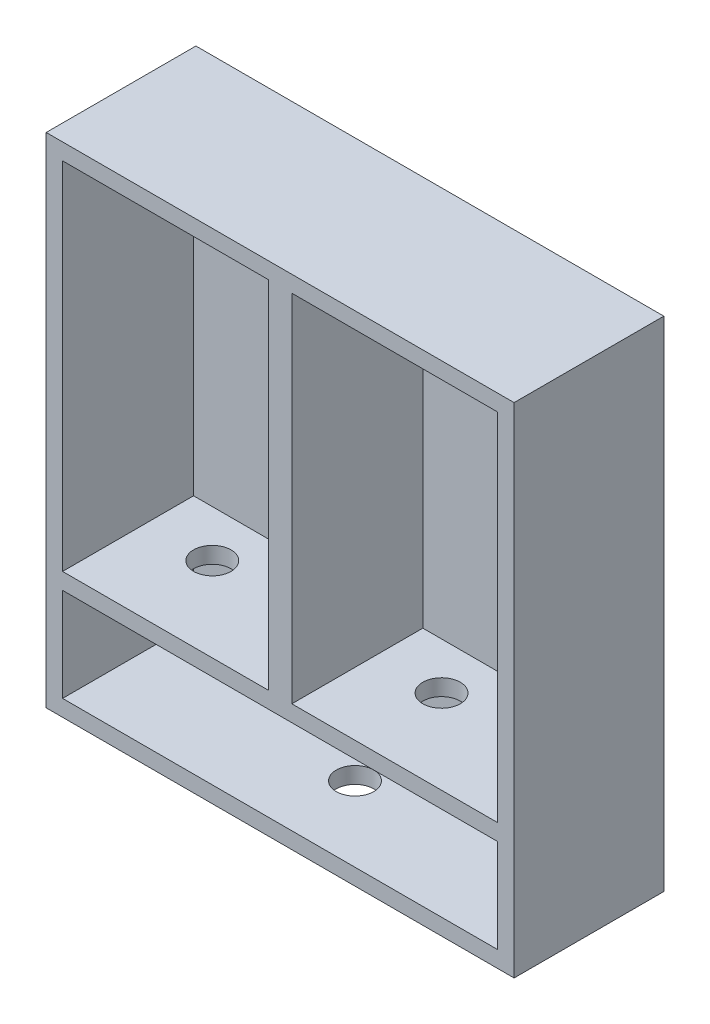
ISO-10303-21;
HEADER;
FILE_DESCRIPTION(('STEP AP214'),'2;1');
FILE_NAME('part.step','',(''),(''),'','','');
FILE_SCHEMA(('AUTOMOTIVE_DESIGN { 1 0 10303 214 1 1 1 1 }'));
ENDSEC;
DATA;
#1=APPLICATION_CONTEXT('core data for automotive mechanical design processes');
#2=APPLICATION_PROTOCOL_DEFINITION('international standard','automotive_design',2000,#1);
#3=PRODUCT_CONTEXT('',#1,'mechanical');
#4=PRODUCT('Part','Part','',(#3));
#5=PRODUCT_RELATED_PRODUCT_CATEGORY('part','',(#4));
#6=PRODUCT_DEFINITION_FORMATION('','',#4);
#7=PRODUCT_DEFINITION_CONTEXT('part definition',#1,'design');
#8=PRODUCT_DEFINITION('design','',#6,#7);
#9=PRODUCT_DEFINITION_SHAPE('','',#8);
#10=(LENGTH_UNIT() NAMED_UNIT(*) SI_UNIT(.MILLI.,.METRE.));
#11=(NAMED_UNIT(*) PLANE_ANGLE_UNIT() SI_UNIT($,.RADIAN.));
#12=(NAMED_UNIT(*) SI_UNIT($,.STERADIAN.) SOLID_ANGLE_UNIT());
#13=UNCERTAINTY_MEASURE_WITH_UNIT(LENGTH_MEASURE(1.E-05),#10,'distance_accuracy_value','');
#14=(GEOMETRIC_REPRESENTATION_CONTEXT(3) GLOBAL_UNCERTAINTY_ASSIGNED_CONTEXT((#13)) GLOBAL_UNIT_ASSIGNED_CONTEXT((#10,
#11,#12)) REPRESENTATION_CONTEXT('',''));
#15=CARTESIAN_POINT('',(0.,0.,0.));
#16=DIRECTION('',(0.,0.,1.));
#17=DIRECTION('',(1.,0.,0.));
#18=AXIS2_PLACEMENT_3D('',#15,#16,#17);
#19=CARTESIAN_POINT('',(0.,0.,20.32));
#20=DIRECTION('',(0.,0.,-1.));
#21=DIRECTION('',(-1.,0.,0.));
#22=AXIS2_PLACEMENT_3D('',#19,#20,#21);
#23=PLANE('',#22);
#24=DIRECTION('',(1.,0.,0.));
#25=VECTOR('',#24,1.);
#26=CARTESIAN_POINT('',(0.,65.405,20.32));
#27=LINE('',#26,#25);
#28=CARTESIAN_POINT('',(-30.1625,65.405,20.32));
#29=VERTEX_POINT('',#28);
#30=CARTESIAN_POINT('',(-2.22249999999996,65.405,20.32));
#31=VERTEX_POINT('',#30);
#32=EDGE_CURVE('E56',#29,#31,#27,.T.);
#33=ORIENTED_EDGE('',*,*,#32,.T.);
#34=DIRECTION('',(0.,1.,0.));
#35=VECTOR('',#34,1.);
#36=CARTESIAN_POINT('',(-2.22249999999998,0.,20.32));
#37=LINE('',#36,#35);
#38=CARTESIAN_POINT('',(-2.22249999999997,17.145,20.32));
#39=VERTEX_POINT('',#38);
#40=EDGE_CURVE('E163',#39,#31,#37,.T.);
#41=ORIENTED_EDGE('',*,*,#40,.F.);
#42=DIRECTION('',(1.,0.,0.));
#43=VECTOR('',#42,1.);
#44=CARTESIAN_POINT('',(0.,17.145,20.32));
#45=LINE('',#44,#43);
#46=CARTESIAN_POINT('',(-30.1625,17.145,20.32));
#47=VERTEX_POINT('',#46);
#48=EDGE_CURVE('E177',#47,#39,#45,.T.);
#49=ORIENTED_EDGE('',*,*,#48,.F.);
#50=DIRECTION('',(0.,-1.,0.));
#51=VECTOR('',#50,1.);
#52=CARTESIAN_POINT('',(-30.1625,0.,20.32));
#53=LINE('',#52,#51);
#54=EDGE_CURVE('E174',#29,#47,#53,.T.);
#55=ORIENTED_EDGE('',*,*,#54,.F.);
#56=EDGE_LOOP('',(#33,#41,#49,#55));
#57=FACE_BOUND('',#56,.T.);
#58=DIRECTION('',(0.,1.,0.));
#59=VECTOR('',#58,1.);
#60=CARTESIAN_POINT('',(0.,0.,20.32));
#61=LINE('',#60,#59);
#62=CARTESIAN_POINT('',(0.,0.,20.32));
#63=VERTEX_POINT('',#62);
#64=CARTESIAN_POINT('',(0.,67.6275,20.32));
#65=VERTEX_POINT('',#64);
#66=EDGE_CURVE('E246',#63,#65,#61,.T.);
#67=ORIENTED_EDGE('',*,*,#66,.T.);
#68=DIRECTION('',(-1.,0.,0.));
#69=VECTOR('',#68,1.);
#70=CARTESIAN_POINT('',(-63.5,67.6275,20.32));
#71=LINE('',#70,#69);
#72=CARTESIAN_POINT('',(-63.5,67.6275,20.32));
#73=VERTEX_POINT('',#72);
#74=EDGE_CURVE('E249',#65,#73,#71,.T.);
#75=ORIENTED_EDGE('',*,*,#74,.T.);
#76=DIRECTION('',(0.,-1.,0.));
#77=VECTOR('',#76,1.);
#78=CARTESIAN_POINT('',(-63.5,0.,20.32));
#79=LINE('',#78,#77);
#80=CARTESIAN_POINT('',(-63.5,0.,20.32));
#81=VERTEX_POINT('',#80);
#82=EDGE_CURVE('E252',#73,#81,#79,.T.);
#83=ORIENTED_EDGE('',*,*,#82,.T.);
#84=DIRECTION('',(1.,0.,0.));
#85=VECTOR('',#84,1.);
#86=CARTESIAN_POINT('',(-63.5,0.,20.32));
#87=LINE('',#86,#85);
#88=EDGE_CURVE('E254',#81,#63,#87,.T.);
#89=ORIENTED_EDGE('',*,*,#88,.T.);
#90=EDGE_LOOP('',(#67,#75,#83,#89));
#91=FACE_BOUND('',#90,.T.);
#92=DIRECTION('',(0.,-1.,0.));
#93=VECTOR('',#92,1.);
#94=CARTESIAN_POINT('',(-33.3375,0.,20.32));
#95=LINE('',#94,#93);
#96=CARTESIAN_POINT('',(-33.3375,65.405,20.32));
#97=VERTEX_POINT('',#96);
#98=CARTESIAN_POINT('',(-33.3375,17.145,20.32));
#99=VERTEX_POINT('',#98);
#100=EDGE_CURVE('E184',#97,#99,#95,.T.);
#101=ORIENTED_EDGE('',*,*,#100,.T.);
#102=DIRECTION('',(1.,0.,0.));
#103=VECTOR('',#102,1.);
#104=CARTESIAN_POINT('',(0.,17.145,20.32));
#105=LINE('',#104,#103);
#106=CARTESIAN_POINT('',(-61.2775,17.145,20.32));
#107=VERTEX_POINT('',#106);
#108=EDGE_CURVE('E219',#107,#99,#105,.T.);
#109=ORIENTED_EDGE('',*,*,#108,.F.);
#110=DIRECTION('',(0.,1.,0.));
#111=VECTOR('',#110,1.);
#112=CARTESIAN_POINT('',(-61.2775,0.,20.32));
#113=LINE('',#112,#111);
#114=CARTESIAN_POINT('',(-61.2775,65.405,20.32));
#115=VERTEX_POINT('',#114);
#116=EDGE_CURVE('E232',#107,#115,#113,.T.);
#117=ORIENTED_EDGE('',*,*,#116,.T.);
#118=DIRECTION('',(1.,0.,0.));
#119=VECTOR('',#118,1.);
#120=CARTESIAN_POINT('',(0.,65.405,20.32));
#121=LINE('',#120,#119);
#122=EDGE_CURVE('E229',#115,#97,#121,.T.);
#123=ORIENTED_EDGE('',*,*,#122,.T.);
#124=EDGE_LOOP('',(#101,#109,#117,#123));
#125=FACE_BOUND('',#124,.T.);
#126=DIRECTION('',(0.,-1.,0.));
#127=VECTOR('',#126,1.);
#128=CARTESIAN_POINT('',(-2.22249999999997,0.,20.32));
#129=LINE('',#128,#127);
#130=CARTESIAN_POINT('',(-2.22249999999997,14.9225,20.32));
#131=VERTEX_POINT('',#130);
#132=CARTESIAN_POINT('',(-2.22249999999997,2.2225,20.32));
#133=VERTEX_POINT('',#132);
#134=EDGE_CURVE('E48',#131,#133,#129,.T.);
#135=ORIENTED_EDGE('',*,*,#134,.T.);
#136=DIRECTION('',(1.,0.,0.));
#137=VECTOR('',#136,1.);
#138=CARTESIAN_POINT('',(0.,2.2225,20.32));
#139=LINE('',#138,#137);
#140=CARTESIAN_POINT('',(-61.2775,2.2225,20.32));
#141=VERTEX_POINT('',#140);
#142=EDGE_CURVE('E191',#141,#133,#139,.T.);
#143=ORIENTED_EDGE('',*,*,#142,.F.);
#144=DIRECTION('',(0.,-1.,0.));
#145=VECTOR('',#144,1.);
#146=CARTESIAN_POINT('',(-61.2775,0.,20.32));
#147=LINE('',#146,#145);
#148=CARTESIAN_POINT('',(-61.2775,14.9225,20.32));
#149=VERTEX_POINT('',#148);
#150=EDGE_CURVE('E205',#149,#141,#147,.T.);
#151=ORIENTED_EDGE('',*,*,#150,.F.);
#152=DIRECTION('',(1.,0.,0.));
#153=VECTOR('',#152,1.);
#154=CARTESIAN_POINT('',(0.,14.9225,20.32));
#155=LINE('',#154,#153);
#156=EDGE_CURVE('E201',#149,#131,#155,.T.);
#157=ORIENTED_EDGE('',*,*,#156,.T.);
#158=EDGE_LOOP('',(#135,#143,#151,#157));
#159=FACE_BOUND('',#158,.T.);
#160=ADVANCED_FACE('F33',(#57,#91,#125,#159),#23,.F.);
#161=CARTESIAN_POINT('',(0.,0.,20.32));
#162=DIRECTION('',(-1.,0.,0.));
#163=DIRECTION('',(0.,0.,1.));
#164=AXIS2_PLACEMENT_3D('',#161,#162,#163);
#165=PLANE('',#164);
#166=DIRECTION('',(0.,1.,0.));
#167=VECTOR('',#166,1.);
#168=CARTESIAN_POINT('',(0.,0.,0.));
#169=LINE('',#168,#167);
#170=CARTESIAN_POINT('',(0.,0.,0.));
#171=VERTEX_POINT('',#170);
#172=CARTESIAN_POINT('',(0.,67.6275,0.));
#173=VERTEX_POINT('',#172);
#174=EDGE_CURVE('E239',#171,#173,#169,.T.);
#175=ORIENTED_EDGE('',*,*,#174,.T.);
#176=DIRECTION('',(0.,0.,-1.));
#177=VECTOR('',#176,1.);
#178=CARTESIAN_POINT('',(0.,67.6275,20.32));
#179=LINE('',#178,#177);
#180=EDGE_CURVE('E11',#65,#173,#179,.T.);
#181=ORIENTED_EDGE('',*,*,#180,.F.);
#182=ORIENTED_EDGE('',*,*,#66,.F.);
#183=DIRECTION('',(0.,0.,-1.));
#184=VECTOR('',#183,1.);
#185=CARTESIAN_POINT('',(0.,0.,20.32));
#186=LINE('',#185,#184);
#187=EDGE_CURVE('E256',#63,#171,#186,.T.);
#188=ORIENTED_EDGE('',*,*,#187,.T.);
#189=EDGE_LOOP('',(#175,#181,#182,#188));
#190=FACE_BOUND('',#189,.T.);
#191=ADVANCED_FACE('F35',(#190),#165,.F.);
#192=CARTESIAN_POINT('',(-63.5,67.6275,20.32));
#193=DIRECTION('',(0.,-1.,0.));
#194=DIRECTION('',(0.,0.,-1.));
#195=AXIS2_PLACEMENT_3D('',#192,#193,#194);
#196=PLANE('',#195);
#197=DIRECTION('',(-1.,0.,0.));
#198=VECTOR('',#197,1.);
#199=CARTESIAN_POINT('',(-63.5,67.6275,0.));
#200=LINE('',#199,#198);
#201=CARTESIAN_POINT('',(-63.5,67.6275,0.));
#202=VERTEX_POINT('',#201);
#203=EDGE_CURVE('E259',#173,#202,#200,.T.);
#204=ORIENTED_EDGE('',*,*,#203,.T.);
#205=DIRECTION('',(0.,0.,-1.));
#206=VECTOR('',#205,1.);
#207=CARTESIAN_POINT('',(-63.5,67.6275,20.32));
#208=LINE('',#207,#206);
#209=EDGE_CURVE('E41',#73,#202,#208,.T.);
#210=ORIENTED_EDGE('',*,*,#209,.F.);
#211=ORIENTED_EDGE('',*,*,#74,.F.);
#212=ORIENTED_EDGE('',*,*,#180,.T.);
#213=EDGE_LOOP('',(#204,#210,#211,#212));
#214=FACE_BOUND('',#213,.T.);
#215=ADVANCED_FACE('F289',(#214),#196,.F.);
#216=CARTESIAN_POINT('',(-63.5,0.,20.32));
#217=DIRECTION('',(1.,0.,0.));
#218=DIRECTION('',(0.,0.,-1.));
#219=AXIS2_PLACEMENT_3D('',#216,#217,#218);
#220=PLANE('',#219);
#221=DIRECTION('',(0.,-1.,0.));
#222=VECTOR('',#221,1.);
#223=CARTESIAN_POINT('',(-63.5,0.,0.));
#224=LINE('',#223,#222);
#225=CARTESIAN_POINT('',(-63.5,0.,0.));
#226=VERTEX_POINT('',#225);
#227=EDGE_CURVE('E261',#202,#226,#224,.T.);
#228=ORIENTED_EDGE('',*,*,#227,.T.);
#229=DIRECTION('',(0.,0.,-1.));
#230=VECTOR('',#229,1.);
#231=CARTESIAN_POINT('',(-63.5,0.,20.32));
#232=LINE('',#231,#230);
#233=EDGE_CURVE('E266',#81,#226,#232,.T.);
#234=ORIENTED_EDGE('',*,*,#233,.F.);
#235=ORIENTED_EDGE('',*,*,#82,.F.);
#236=ORIENTED_EDGE('',*,*,#209,.T.);
#237=EDGE_LOOP('',(#228,#234,#235,#236));
#238=FACE_BOUND('',#237,.T.);
#239=ADVANCED_FACE('F273',(#238),#220,.F.);
#240=CARTESIAN_POINT('',(-63.5,0.,20.32));
#241=DIRECTION('',(0.,1.,0.));
#242=DIRECTION('',(0.,0.,1.));
#243=AXIS2_PLACEMENT_3D('',#240,#241,#242);
#244=PLANE('',#243);
#245=CARTESIAN_POINT('',(-31.75,0.,10.16));
#246=DIRECTION('',(0.,-1.,0.));
#247=DIRECTION('',(0.,0.,-1.));
#248=AXIS2_PLACEMENT_3D('',#245,#246,#247);
#249=CIRCLE('',#248,2.54);
#250=CARTESIAN_POINT('',(-31.75,0.,7.62));
#251=VERTEX_POINT('',#250);
#252=EDGE_CURVE('E313',#251,#251,#249,.T.);
#253=ORIENTED_EDGE('',*,*,#252,.F.);
#254=EDGE_LOOP('',(#253));
#255=FACE_BOUND('',#254,.T.);
#256=DIRECTION('',(1.,0.,0.));
#257=VECTOR('',#256,1.);
#258=CARTESIAN_POINT('',(-63.5,0.,0.));
#259=LINE('',#258,#257);
#260=EDGE_CURVE('E250',#226,#171,#259,.T.);
#261=ORIENTED_EDGE('',*,*,#260,.T.);
#262=ORIENTED_EDGE('',*,*,#187,.F.);
#263=ORIENTED_EDGE('',*,*,#88,.F.);
#264=ORIENTED_EDGE('',*,*,#233,.T.);
#265=EDGE_LOOP('',(#261,#262,#263,#264));
#266=FACE_BOUND('',#265,.T.);
#267=ADVANCED_FACE('F282',(#255,#266),#244,.F.);
#268=CARTESIAN_POINT('',(0.,0.,0.));
#269=DIRECTION('',(0.,0.,-1.));
#270=DIRECTION('',(-1.,0.,0.));
#271=AXIS2_PLACEMENT_3D('',#268,#269,#270);
#272=PLANE('',#271);
#273=ORIENTED_EDGE('',*,*,#174,.F.);
#274=ORIENTED_EDGE('',*,*,#260,.F.);
#275=ORIENTED_EDGE('',*,*,#227,.F.);
#276=ORIENTED_EDGE('',*,*,#203,.F.);
#277=EDGE_LOOP('',(#273,#274,#275,#276));
#278=FACE_BOUND('',#277,.T.);
#279=ADVANCED_FACE('F279',(#278),#272,.T.);
#280=CARTESIAN_POINT('',(-33.3375,0.,2.54));
#281=DIRECTION('',(-1.,0.,0.));
#282=DIRECTION('',(0.,-1.,0.));
#283=AXIS2_PLACEMENT_3D('',#280,#281,#282);
#284=PLANE('',#283);
#285=ORIENTED_EDGE('',*,*,#100,.F.);
#286=DIRECTION('',(0.,0.,1.));
#287=VECTOR('',#286,1.);
#288=CARTESIAN_POINT('',(-33.3375,65.405,2.54));
#289=LINE('',#288,#287);
#290=CARTESIAN_POINT('',(-33.3375,65.405,2.54));
#291=VERTEX_POINT('',#290);
#292=EDGE_CURVE('E226',#291,#97,#289,.T.);
#293=ORIENTED_EDGE('',*,*,#292,.F.);
#294=DIRECTION('',(0.,-1.,0.));
#295=VECTOR('',#294,1.);
#296=CARTESIAN_POINT('',(-33.3375,0.,2.54));
#297=LINE('',#296,#295);
#298=CARTESIAN_POINT('',(-33.3375,17.145,2.54));
#299=VERTEX_POINT('',#298);
#300=EDGE_CURVE('E216',#291,#299,#297,.T.);
#301=ORIENTED_EDGE('',*,*,#300,.T.);
#302=DIRECTION('',(0.,0.,1.));
#303=VECTOR('',#302,1.);
#304=CARTESIAN_POINT('',(-33.3375,17.145,2.54));
#305=LINE('',#304,#303);
#306=EDGE_CURVE('E237',#299,#99,#305,.T.);
#307=ORIENTED_EDGE('',*,*,#306,.T.);
#308=EDGE_LOOP('',(#285,#293,#301,#307));
#309=FACE_BOUND('',#308,.T.);
#310=ADVANCED_FACE('F303',(#309),#284,.T.);
#311=CARTESIAN_POINT('',(0.,17.145,2.54));
#312=DIRECTION('',(0.,-1.,0.));
#313=DIRECTION('',(1.,0.,0.));
#314=AXIS2_PLACEMENT_3D('',#311,#312,#313);
#315=PLANE('',#314);
#316=CARTESIAN_POINT('',(-52.3875,17.145,8.89));
#317=DIRECTION('',(0.,-1.,0.));
#318=DIRECTION('',(1.,0.,0.));
#319=AXIS2_PLACEMENT_3D('',#316,#317,#318);
#320=CIRCLE('',#319,2.54);
#321=CARTESIAN_POINT('',(-49.8475,17.145,8.89));
#322=VERTEX_POINT('',#321);
#323=EDGE_CURVE('E315',#322,#322,#320,.F.);
#324=ORIENTED_EDGE('',*,*,#323,.F.);
#325=EDGE_LOOP('',(#324));
#326=FACE_BOUND('',#325,.T.);
#327=ORIENTED_EDGE('',*,*,#108,.T.);
#328=ORIENTED_EDGE('',*,*,#306,.F.);
#329=DIRECTION('',(1.,0.,0.));
#330=VECTOR('',#329,1.);
#331=CARTESIAN_POINT('',(0.,17.145,2.54));
#332=LINE('',#331,#330);
#333=CARTESIAN_POINT('',(-61.2775,17.145,2.54));
#334=VERTEX_POINT('',#333);
#335=EDGE_CURVE('E223',#334,#299,#332,.T.);
#336=ORIENTED_EDGE('',*,*,#335,.F.);
#337=DIRECTION('',(0.,0.,1.));
#338=VECTOR('',#337,1.);
#339=CARTESIAN_POINT('',(-61.2775,17.145,2.54));
#340=LINE('',#339,#338);
#341=EDGE_CURVE('E240',#334,#107,#340,.T.);
#342=ORIENTED_EDGE('',*,*,#341,.T.);
#343=EDGE_LOOP('',(#327,#328,#336,#342));
#344=FACE_BOUND('',#343,.T.);
#345=ADVANCED_FACE('F371',(#326,#344),#315,.F.);
#346=CARTESIAN_POINT('',(-61.2775,0.,2.54));
#347=DIRECTION('',(1.,0.,0.));
#348=DIRECTION('',(0.,0.,-1.));
#349=AXIS2_PLACEMENT_3D('',#346,#347,#348);
#350=PLANE('',#349);
#351=ORIENTED_EDGE('',*,*,#116,.F.);
#352=ORIENTED_EDGE('',*,*,#341,.F.);
#353=DIRECTION('',(0.,1.,0.));
#354=VECTOR('',#353,1.);
#355=CARTESIAN_POINT('',(-61.2775,0.,2.54));
#356=LINE('',#355,#354);
#357=CARTESIAN_POINT('',(-61.2775,65.405,2.54));
#358=VERTEX_POINT('',#357);
#359=EDGE_CURVE('E221',#334,#358,#356,.T.);
#360=ORIENTED_EDGE('',*,*,#359,.T.);
#361=DIRECTION('',(0.,0.,1.));
#362=VECTOR('',#361,1.);
#363=CARTESIAN_POINT('',(-61.2775,65.405,2.54));
#364=LINE('',#363,#362);
#365=EDGE_CURVE('E242',#358,#115,#364,.T.);
#366=ORIENTED_EDGE('',*,*,#365,.T.);
#367=EDGE_LOOP('',(#351,#352,#360,#366));
#368=FACE_BOUND('',#367,.T.);
#369=ADVANCED_FACE('F374',(#368),#350,.T.);
#370=CARTESIAN_POINT('',(0.,65.405,2.54));
#371=DIRECTION('',(0.,-1.,0.));
#372=DIRECTION('',(1.,0.,0.));
#373=AXIS2_PLACEMENT_3D('',#370,#371,#372);
#374=PLANE('',#373);
#375=ORIENTED_EDGE('',*,*,#122,.F.);
#376=ORIENTED_EDGE('',*,*,#365,.F.);
#377=DIRECTION('',(1.,0.,0.));
#378=VECTOR('',#377,1.);
#379=CARTESIAN_POINT('',(0.,65.405,2.54));
#380=LINE('',#379,#378);
#381=EDGE_CURVE('E218',#358,#291,#380,.T.);
#382=ORIENTED_EDGE('',*,*,#381,.T.);
#383=ORIENTED_EDGE('',*,*,#292,.T.);
#384=EDGE_LOOP('',(#375,#376,#382,#383));
#385=FACE_BOUND('',#384,.T.);
#386=ADVANCED_FACE('F369',(#385),#374,.T.);
#387=CARTESIAN_POINT('',(0.,0.,2.54));
#388=DIRECTION('',(0.,0.,1.));
#389=DIRECTION('',(1.,0.,0.));
#390=AXIS2_PLACEMENT_3D('',#387,#388,#389);
#391=PLANE('',#390);
#392=ORIENTED_EDGE('',*,*,#300,.F.);
#393=ORIENTED_EDGE('',*,*,#381,.F.);
#394=ORIENTED_EDGE('',*,*,#359,.F.);
#395=ORIENTED_EDGE('',*,*,#335,.T.);
#396=EDGE_LOOP('',(#392,#393,#394,#395));
#397=FACE_BOUND('',#396,.T.);
#398=ADVANCED_FACE('F366',(#397),#391,.T.);
#399=CARTESIAN_POINT('',(0.,65.405,2.54));
#400=DIRECTION('',(0.,-1.,0.));
#401=DIRECTION('',(1.,0.,0.));
#402=AXIS2_PLACEMENT_3D('',#399,#400,#401);
#403=PLANE('',#402);
#404=ORIENTED_EDGE('',*,*,#32,.F.);
#405=DIRECTION('',(0.,0.,1.));
#406=VECTOR('',#405,1.);
#407=CARTESIAN_POINT('',(-30.1625,65.405,2.54));
#408=LINE('',#407,#406);
#409=CARTESIAN_POINT('',(-30.1625,65.405,2.54));
#410=VERTEX_POINT('',#409);
#411=EDGE_CURVE('E144',#410,#29,#408,.T.);
#412=ORIENTED_EDGE('',*,*,#411,.F.);
#413=DIRECTION('',(1.,0.,0.));
#414=VECTOR('',#413,1.);
#415=CARTESIAN_POINT('',(0.,65.405,2.54));
#416=LINE('',#415,#414);
#417=CARTESIAN_POINT('',(-2.22249999999996,65.405,2.54));
#418=VERTEX_POINT('',#417);
#419=EDGE_CURVE('E147',#410,#418,#416,.T.);
#420=ORIENTED_EDGE('',*,*,#419,.T.);
#421=DIRECTION('',(0.,0.,1.));
#422=VECTOR('',#421,1.);
#423=CARTESIAN_POINT('',(-2.22249999999996,65.405,2.54));
#424=LINE('',#423,#422);
#425=EDGE_CURVE('E182',#418,#31,#424,.T.);
#426=ORIENTED_EDGE('',*,*,#425,.T.);
#427=EDGE_LOOP('',(#404,#412,#420,#426));
#428=FACE_BOUND('',#427,.T.);
#429=ADVANCED_FACE('F146',(#428),#403,.T.);
#430=CARTESIAN_POINT('',(-2.22249999999998,0.,2.54));
#431=DIRECTION('',(1.,0.,0.));
#432=DIRECTION('',(0.,1.,0.));
#433=AXIS2_PLACEMENT_3D('',#430,#431,#432);
#434=PLANE('',#433);
#435=ORIENTED_EDGE('',*,*,#40,.T.);
#436=ORIENTED_EDGE('',*,*,#425,.F.);
#437=DIRECTION('',(0.,1.,0.));
#438=VECTOR('',#437,1.);
#439=CARTESIAN_POINT('',(-2.22249999999998,0.,2.54));
#440=LINE('',#439,#438);
#441=CARTESIAN_POINT('',(-2.22249999999997,17.145,2.54));
#442=VERTEX_POINT('',#441);
#443=EDGE_CURVE('E154',#442,#418,#440,.T.);
#444=ORIENTED_EDGE('',*,*,#443,.F.);
#445=DIRECTION('',(0.,0.,1.));
#446=VECTOR('',#445,1.);
#447=CARTESIAN_POINT('',(-2.22249999999997,17.145,2.54));
#448=LINE('',#447,#446);
#449=EDGE_CURVE('E185',#442,#39,#448,.T.);
#450=ORIENTED_EDGE('',*,*,#449,.T.);
#451=EDGE_LOOP('',(#435,#436,#444,#450));
#452=FACE_BOUND('',#451,.T.);
#453=ADVANCED_FACE('F428',(#452),#434,.F.);
#454=CARTESIAN_POINT('',(0.,17.145,2.54));
#455=DIRECTION('',(0.,-1.,0.));
#456=DIRECTION('',(1.,0.,0.));
#457=AXIS2_PLACEMENT_3D('',#454,#455,#456);
#458=PLANE('',#457);
#459=CARTESIAN_POINT('',(-21.2725,17.145,8.89));
#460=DIRECTION('',(0.,-1.,0.));
#461=DIRECTION('',(1.,0.,0.));
#462=AXIS2_PLACEMENT_3D('',#459,#460,#461);
#463=CIRCLE('',#462,2.54);
#464=CARTESIAN_POINT('',(-18.7325,17.145,8.89));
#465=VERTEX_POINT('',#464);
#466=EDGE_CURVE('E322',#465,#465,#463,.F.);
#467=ORIENTED_EDGE('',*,*,#466,.F.);
#468=EDGE_LOOP('',(#467));
#469=FACE_BOUND('',#468,.T.);
#470=ORIENTED_EDGE('',*,*,#48,.T.);
#471=ORIENTED_EDGE('',*,*,#449,.F.);
#472=DIRECTION('',(1.,0.,0.));
#473=VECTOR('',#472,1.);
#474=CARTESIAN_POINT('',(0.,17.145,2.54));
#475=LINE('',#474,#473);
#476=CARTESIAN_POINT('',(-30.1625,17.145,2.54));
#477=VERTEX_POINT('',#476);
#478=EDGE_CURVE('E167',#477,#442,#475,.T.);
#479=ORIENTED_EDGE('',*,*,#478,.F.);
#480=DIRECTION('',(0.,0.,1.));
#481=VECTOR('',#480,1.);
#482=CARTESIAN_POINT('',(-30.1625,17.145,2.54));
#483=LINE('',#482,#481);
#484=EDGE_CURVE('E153',#477,#47,#483,.T.);
#485=ORIENTED_EDGE('',*,*,#484,.T.);
#486=EDGE_LOOP('',(#470,#471,#479,#485));
#487=FACE_BOUND('',#486,.T.);
#488=ADVANCED_FACE('F437',(#469,#487),#458,.F.);
#489=CARTESIAN_POINT('',(-30.1625,0.,2.54));
#490=DIRECTION('',(-1.,0.,0.));
#491=DIRECTION('',(0.,-1.,0.));
#492=AXIS2_PLACEMENT_3D('',#489,#490,#491);
#493=PLANE('',#492);
#494=ORIENTED_EDGE('',*,*,#54,.T.);
#495=ORIENTED_EDGE('',*,*,#484,.F.);
#496=DIRECTION('',(0.,-1.,0.));
#497=VECTOR('',#496,1.);
#498=CARTESIAN_POINT('',(-30.1625,0.,2.54));
#499=LINE('',#498,#497);
#500=EDGE_CURVE('E161',#410,#477,#499,.T.);
#501=ORIENTED_EDGE('',*,*,#500,.F.);
#502=ORIENTED_EDGE('',*,*,#411,.T.);
#503=EDGE_LOOP('',(#494,#495,#501,#502));
#504=FACE_BOUND('',#503,.T.);
#505=ADVANCED_FACE('F165',(#504),#493,.F.);
#506=CARTESIAN_POINT('',(0.,0.,2.54));
#507=DIRECTION('',(0.,0.,1.));
#508=DIRECTION('',(1.,0.,0.));
#509=AXIS2_PLACEMENT_3D('',#506,#507,#508);
#510=PLANE('',#509);
#511=ORIENTED_EDGE('',*,*,#419,.F.);
#512=ORIENTED_EDGE('',*,*,#500,.T.);
#513=ORIENTED_EDGE('',*,*,#478,.T.);
#514=ORIENTED_EDGE('',*,*,#443,.T.);
#515=EDGE_LOOP('',(#511,#512,#513,#514));
#516=FACE_BOUND('',#515,.T.);
#517=ADVANCED_FACE('F159',(#516),#510,.T.);
#518=CARTESIAN_POINT('',(-2.22249999999997,0.,2.54));
#519=DIRECTION('',(-1.,0.,0.));
#520=DIRECTION('',(0.,-1.,0.));
#521=AXIS2_PLACEMENT_3D('',#518,#519,#520);
#522=PLANE('',#521);
#523=ORIENTED_EDGE('',*,*,#134,.F.);
#524=DIRECTION('',(0.,0.,1.));
#525=VECTOR('',#524,1.);
#526=CARTESIAN_POINT('',(-2.22249999999997,14.9225,2.54));
#527=LINE('',#526,#525);
#528=CARTESIAN_POINT('',(-2.22249999999997,14.9225,2.54));
#529=VERTEX_POINT('',#528);
#530=EDGE_CURVE('E199',#529,#131,#527,.T.);
#531=ORIENTED_EDGE('',*,*,#530,.F.);
#532=DIRECTION('',(0.,-1.,0.));
#533=VECTOR('',#532,1.);
#534=CARTESIAN_POINT('',(-2.22249999999997,0.,2.54));
#535=LINE('',#534,#533);
#536=CARTESIAN_POINT('',(-2.22249999999997,2.2225,2.54));
#537=VERTEX_POINT('',#536);
#538=EDGE_CURVE('E188',#529,#537,#535,.T.);
#539=ORIENTED_EDGE('',*,*,#538,.T.);
#540=DIRECTION('',(0.,0.,1.));
#541=VECTOR('',#540,1.);
#542=CARTESIAN_POINT('',(-2.22249999999997,2.2225,2.54));
#543=LINE('',#542,#541);
#544=EDGE_CURVE('E175',#537,#133,#543,.T.);
#545=ORIENTED_EDGE('',*,*,#544,.T.);
#546=EDGE_LOOP('',(#523,#531,#539,#545));
#547=FACE_BOUND('',#546,.T.);
#548=ADVANCED_FACE('F354',(#547),#522,.T.);
#549=CARTESIAN_POINT('',(0.,2.2225,2.54));
#550=DIRECTION('',(0.,-1.,0.));
#551=DIRECTION('',(1.,0.,0.));
#552=AXIS2_PLACEMENT_3D('',#549,#550,#551);
#553=PLANE('',#552);
#554=CARTESIAN_POINT('',(-31.75,2.2225,10.16));
#555=DIRECTION('',(0.,-1.,0.));
#556=DIRECTION('',(1.,0.,0.));
#557=AXIS2_PLACEMENT_3D('',#554,#555,#556);
#558=CIRCLE('',#557,2.54);
#559=CARTESIAN_POINT('',(-29.21,2.2225,10.16));
#560=VERTEX_POINT('',#559);
#561=EDGE_CURVE('E202',#560,#560,#558,.F.);
#562=ORIENTED_EDGE('',*,*,#561,.F.);
#563=EDGE_LOOP('',(#562));
#564=FACE_BOUND('',#563,.T.);
#565=ORIENTED_EDGE('',*,*,#142,.T.);
#566=ORIENTED_EDGE('',*,*,#544,.F.);
#567=DIRECTION('',(1.,0.,0.));
#568=VECTOR('',#567,1.);
#569=CARTESIAN_POINT('',(0.,2.2225,2.54));
#570=LINE('',#569,#568);
#571=CARTESIAN_POINT('',(-61.2775,2.2225,2.54));
#572=VERTEX_POINT('',#571);
#573=EDGE_CURVE('E196',#572,#537,#570,.T.);
#574=ORIENTED_EDGE('',*,*,#573,.F.);
#575=DIRECTION('',(0.,0.,1.));
#576=VECTOR('',#575,1.);
#577=CARTESIAN_POINT('',(-61.2775,2.2225,2.54));
#578=LINE('',#577,#576);
#579=EDGE_CURVE('E211',#572,#141,#578,.T.);
#580=ORIENTED_EDGE('',*,*,#579,.T.);
#581=EDGE_LOOP('',(#565,#566,#574,#580));
#582=FACE_BOUND('',#581,.T.);
#583=ADVANCED_FACE('F353',(#564,#582),#553,.F.);
#584=CARTESIAN_POINT('',(-61.2775,0.,2.54));
#585=DIRECTION('',(-1.,0.,0.));
#586=DIRECTION('',(0.,0.,1.));
#587=AXIS2_PLACEMENT_3D('',#584,#585,#586);
#588=PLANE('',#587);
#589=ORIENTED_EDGE('',*,*,#150,.T.);
#590=ORIENTED_EDGE('',*,*,#579,.F.);
#591=DIRECTION('',(0.,-1.,0.));
#592=VECTOR('',#591,1.);
#593=CARTESIAN_POINT('',(-61.2775,0.,2.54));
#594=LINE('',#593,#592);
#595=CARTESIAN_POINT('',(-61.2775,14.9225,2.54));
#596=VERTEX_POINT('',#595);
#597=EDGE_CURVE('E193',#596,#572,#594,.T.);
#598=ORIENTED_EDGE('',*,*,#597,.F.);
#599=DIRECTION('',(0.,0.,1.));
#600=VECTOR('',#599,1.);
#601=CARTESIAN_POINT('',(-61.2775,14.9225,2.54));
#602=LINE('',#601,#600);
#603=EDGE_CURVE('E213',#596,#149,#602,.T.);
#604=ORIENTED_EDGE('',*,*,#603,.T.);
#605=EDGE_LOOP('',(#589,#590,#598,#604));
#606=FACE_BOUND('',#605,.T.);
#607=ADVANCED_FACE('F337',(#606),#588,.F.);
#608=CARTESIAN_POINT('',(0.,14.9225,2.54));
#609=DIRECTION('',(0.,-1.,0.));
#610=DIRECTION('',(0.,0.,-1.));
#611=AXIS2_PLACEMENT_3D('',#608,#609,#610);
#612=PLANE('',#611);
#613=CARTESIAN_POINT('',(-52.3875,14.9225,8.89));
#614=DIRECTION('',(0.,-1.,0.));
#615=DIRECTION('',(0.,0.,-1.));
#616=AXIS2_PLACEMENT_3D('',#613,#614,#615);
#617=CIRCLE('',#616,2.54);
#618=CARTESIAN_POINT('',(-52.3875,14.9225,6.35));
#619=VERTEX_POINT('',#618);
#620=EDGE_CURVE('E319',#619,#619,#617,.T.);
#621=ORIENTED_EDGE('',*,*,#620,.F.);
#622=EDGE_LOOP('',(#621));
#623=FACE_BOUND('',#622,.T.);
#624=CARTESIAN_POINT('',(-21.2725,14.9225,8.89));
#625=DIRECTION('',(0.,-1.,0.));
#626=DIRECTION('',(0.,0.,-1.));
#627=AXIS2_PLACEMENT_3D('',#624,#625,#626);
#628=CIRCLE('',#627,2.54);
#629=CARTESIAN_POINT('',(-21.2725,14.9225,6.35));
#630=VERTEX_POINT('',#629);
#631=EDGE_CURVE('E325',#630,#630,#628,.T.);
#632=ORIENTED_EDGE('',*,*,#631,.F.);
#633=EDGE_LOOP('',(#632));
#634=FACE_BOUND('',#633,.T.);
#635=ORIENTED_EDGE('',*,*,#156,.F.);
#636=ORIENTED_EDGE('',*,*,#603,.F.);
#637=DIRECTION('',(1.,0.,0.));
#638=VECTOR('',#637,1.);
#639=CARTESIAN_POINT('',(0.,14.9225,2.54));
#640=LINE('',#639,#638);
#641=EDGE_CURVE('E190',#596,#529,#640,.T.);
#642=ORIENTED_EDGE('',*,*,#641,.T.);
#643=ORIENTED_EDGE('',*,*,#530,.T.);
#644=EDGE_LOOP('',(#635,#636,#642,#643));
#645=FACE_BOUND('',#644,.T.);
#646=ADVANCED_FACE('F333',(#623,#634,#645),#612,.T.);
#647=CARTESIAN_POINT('',(0.,0.,2.54));
#648=DIRECTION('',(0.,0.,1.));
#649=DIRECTION('',(1.,0.,0.));
#650=AXIS2_PLACEMENT_3D('',#647,#648,#649);
#651=PLANE('',#650);
#652=ORIENTED_EDGE('',*,*,#538,.F.);
#653=ORIENTED_EDGE('',*,*,#641,.F.);
#654=ORIENTED_EDGE('',*,*,#597,.T.);
#655=ORIENTED_EDGE('',*,*,#573,.T.);
#656=EDGE_LOOP('',(#652,#653,#654,#655));
#657=FACE_BOUND('',#656,.T.);
#658=ADVANCED_FACE('F336',(#657),#651,.T.);
#659=CARTESIAN_POINT('',(-31.75,9.40670489685532,10.16));
#660=DIRECTION('',(0.,-1.,0.));
#661=DIRECTION('',(0.,0.,-1.));
#662=AXIS2_PLACEMENT_3D('',#659,#660,#661);
#663=CYLINDRICAL_SURFACE('',#662,2.54);
#664=ORIENTED_EDGE('',*,*,#561,.T.);
#665=EDGE_LOOP('',(#664));
#666=FACE_BOUND('',#665,.T.);
#667=ORIENTED_EDGE('',*,*,#252,.T.);
#668=EDGE_LOOP('',(#667));
#669=FACE_BOUND('',#668,.T.);
#670=ADVANCED_FACE('F475',(#666,#669),#663,.F.);
#671=CARTESIAN_POINT('',(-21.2725,24.3292048968553,8.89));
#672=DIRECTION('',(0.,-1.,0.));
#673=DIRECTION('',(0.,0.,-1.));
#674=AXIS2_PLACEMENT_3D('',#671,#672,#673);
#675=CYLINDRICAL_SURFACE('',#674,2.54);
#676=ORIENTED_EDGE('',*,*,#466,.T.);
#677=EDGE_LOOP('',(#676));
#678=FACE_BOUND('',#677,.T.);
#679=ORIENTED_EDGE('',*,*,#631,.T.);
#680=EDGE_LOOP('',(#679));
#681=FACE_BOUND('',#680,.T.);
#682=ADVANCED_FACE('F495',(#678,#681),#675,.F.);
#683=CARTESIAN_POINT('',(-52.3875,24.3292048968553,8.89));
#684=DIRECTION('',(0.,-1.,0.));
#685=DIRECTION('',(0.,0.,-1.));
#686=AXIS2_PLACEMENT_3D('',#683,#684,#685);
#687=CYLINDRICAL_SURFACE('',#686,2.54);
#688=ORIENTED_EDGE('',*,*,#323,.T.);
#689=EDGE_LOOP('',(#688));
#690=FACE_BOUND('',#689,.T.);
#691=ORIENTED_EDGE('',*,*,#620,.T.);
#692=EDGE_LOOP('',(#691));
#693=FACE_BOUND('',#692,.T.);
#694=ADVANCED_FACE('F331',(#690,#693),#687,.F.);
#695=CLOSED_SHELL('',(#160,#191,#215,#239,#267,#279,#310,#345,#369,#386,#398,#429,#453,#488,
#505,#517,#548,#583,#607,#646,#658,#670,#682,#694));
#696=MANIFOLD_SOLID_BREP('B2',#695);
#697=ADVANCED_BREP_SHAPE_REPRESENTATION('',(#18,#696),#14);
#698=SHAPE_DEFINITION_REPRESENTATION(#9,#697);
ENDSEC;
END-ISO-10303-21;
